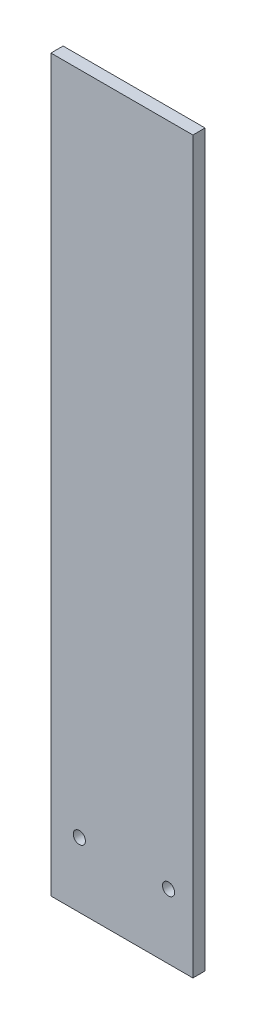
ISO-10303-21;
HEADER;
FILE_DESCRIPTION(('STEP AP214'),'2;1');
FILE_NAME('part.step','',(''),(''),'','','');
FILE_SCHEMA(('AUTOMOTIVE_DESIGN { 1 0 10303 214 1 1 1 1 }'));
ENDSEC;
DATA;
#1=APPLICATION_CONTEXT('core data for automotive mechanical design processes');
#2=APPLICATION_PROTOCOL_DEFINITION('international standard','automotive_design',2000,#1);
#3=PRODUCT_CONTEXT('',#1,'mechanical');
#4=PRODUCT('Part','Part','',(#3));
#5=PRODUCT_RELATED_PRODUCT_CATEGORY('part','',(#4));
#6=PRODUCT_DEFINITION_FORMATION('','',#4);
#7=PRODUCT_DEFINITION_CONTEXT('part definition',#1,'design');
#8=PRODUCT_DEFINITION('design','',#6,#7);
#9=PRODUCT_DEFINITION_SHAPE('','',#8);
#10=(LENGTH_UNIT() NAMED_UNIT(*) SI_UNIT(.MILLI.,.METRE.));
#11=(NAMED_UNIT(*) PLANE_ANGLE_UNIT() SI_UNIT($,.RADIAN.));
#12=(NAMED_UNIT(*) SI_UNIT($,.STERADIAN.) SOLID_ANGLE_UNIT());
#13=UNCERTAINTY_MEASURE_WITH_UNIT(LENGTH_MEASURE(1.E-05),#10,'distance_accuracy_value','');
#14=(GEOMETRIC_REPRESENTATION_CONTEXT(3) GLOBAL_UNCERTAINTY_ASSIGNED_CONTEXT((#13)) GLOBAL_UNIT_ASSIGNED_CONTEXT((#10,
#11,#12)) REPRESENTATION_CONTEXT('',''));
#15=CARTESIAN_POINT('',(0.,0.,0.));
#16=DIRECTION('',(0.,0.,1.));
#17=DIRECTION('',(1.,0.,0.));
#18=AXIS2_PLACEMENT_3D('',#15,#16,#17);
#19=CARTESIAN_POINT('',(0.,0.,3.));
#20=DIRECTION('',(0.,0.,1.));
#21=DIRECTION('',(1.,0.,0.));
#22=AXIS2_PLACEMENT_3D('',#19,#20,#21);
#23=PLANE('',#22);
#24=CARTESIAN_POINT('',(11.5000000000037,-74.,3.));
#25=DIRECTION('',(0.,0.,1.));
#26=DIRECTION('',(1.,0.,0.));
#27=AXIS2_PLACEMENT_3D('',#24,#25,#26);
#28=CIRCLE('',#27,1.50000000000001);
#29=CARTESIAN_POINT('',(13.0000000000037,-74.,3.));
#30=VERTEX_POINT('',#29);
#31=EDGE_CURVE('E112',#30,#30,#28,.T.);
#32=ORIENTED_EDGE('',*,*,#31,.F.);
#33=EDGE_LOOP('',(#32));
#34=FACE_BOUND('',#33,.T.);
#35=DIRECTION('',(0.,1.,0.));
#36=VECTOR('',#35,1.);
#37=CARTESIAN_POINT('',(17.5,90.,3.));
#38=LINE('',#37,#36);
#39=CARTESIAN_POINT('',(17.5,-90.,3.));
#40=VERTEX_POINT('',#39);
#41=CARTESIAN_POINT('',(17.5,90.,3.));
#42=VERTEX_POINT('',#41);
#43=EDGE_CURVE('E97',#40,#42,#38,.T.);
#44=ORIENTED_EDGE('',*,*,#43,.T.);
#45=DIRECTION('',(-1.,0.,0.));
#46=VECTOR('',#45,1.);
#47=CARTESIAN_POINT('',(-17.5,90.,3.));
#48=LINE('',#47,#46);
#49=CARTESIAN_POINT('',(-17.5,90.,3.));
#50=VERTEX_POINT('',#49);
#51=EDGE_CURVE('E92',#42,#50,#48,.T.);
#52=ORIENTED_EDGE('',*,*,#51,.T.);
#53=DIRECTION('',(0.,-1.,0.));
#54=VECTOR('',#53,1.);
#55=CARTESIAN_POINT('',(-17.5,90.,3.));
#56=LINE('',#55,#54);
#57=CARTESIAN_POINT('',(-17.5,-90.,3.));
#58=VERTEX_POINT('',#57);
#59=EDGE_CURVE('E95',#50,#58,#56,.T.);
#60=ORIENTED_EDGE('',*,*,#59,.T.);
#61=DIRECTION('',(1.,0.,0.));
#62=VECTOR('',#61,1.);
#63=CARTESIAN_POINT('',(-17.5,-90.,3.));
#64=LINE('',#63,#62);
#65=EDGE_CURVE('E62',#58,#40,#64,.T.);
#66=ORIENTED_EDGE('',*,*,#65,.T.);
#67=EDGE_LOOP('',(#44,#52,#60,#66));
#68=FACE_BOUND('',#67,.T.);
#69=CARTESIAN_POINT('',(-10.4999999999963,-74.,3.));
#70=DIRECTION('',(0.,0.,1.));
#71=DIRECTION('',(1.,0.,0.));
#72=AXIS2_PLACEMENT_3D('',#69,#70,#71);
#73=CIRCLE('',#72,1.50000000000001);
#74=CARTESIAN_POINT('',(-8.99999999999629,-74.,3.));
#75=VERTEX_POINT('',#74);
#76=EDGE_CURVE('E127',#75,#75,#73,.T.);
#77=ORIENTED_EDGE('',*,*,#76,.F.);
#78=EDGE_LOOP('',(#77));
#79=FACE_BOUND('',#78,.T.);
#80=ADVANCED_FACE('F45',(#34,#68,#79),#23,.T.);
#81=CARTESIAN_POINT('',(0.,0.,0.));
#82=DIRECTION('',(0.,0.,1.));
#83=DIRECTION('',(1.,0.,0.));
#84=AXIS2_PLACEMENT_3D('',#81,#82,#83);
#85=PLANE('',#84);
#86=DIRECTION('',(0.,1.,0.));
#87=VECTOR('',#86,1.);
#88=CARTESIAN_POINT('',(17.5,90.,0.));
#89=LINE('',#88,#87);
#90=CARTESIAN_POINT('',(17.5,-90.,0.));
#91=VERTEX_POINT('',#90);
#92=CARTESIAN_POINT('',(17.5,90.,0.));
#93=VERTEX_POINT('',#92);
#94=EDGE_CURVE('E109',#91,#93,#89,.T.);
#95=ORIENTED_EDGE('',*,*,#94,.F.);
#96=DIRECTION('',(1.,0.,0.));
#97=VECTOR('',#96,1.);
#98=CARTESIAN_POINT('',(-17.5,-90.,0.));
#99=LINE('',#98,#97);
#100=CARTESIAN_POINT('',(-17.5,-90.,0.));
#101=VERTEX_POINT('',#100);
#102=EDGE_CURVE('E85',#101,#91,#99,.T.);
#103=ORIENTED_EDGE('',*,*,#102,.F.);
#104=DIRECTION('',(0.,-1.,0.));
#105=VECTOR('',#104,1.);
#106=CARTESIAN_POINT('',(-17.5,90.,0.));
#107=LINE('',#106,#105);
#108=CARTESIAN_POINT('',(-17.5,90.,0.));
#109=VERTEX_POINT('',#108);
#110=EDGE_CURVE('E79',#109,#101,#107,.T.);
#111=ORIENTED_EDGE('',*,*,#110,.F.);
#112=DIRECTION('',(-1.,0.,0.));
#113=VECTOR('',#112,1.);
#114=CARTESIAN_POINT('',(-17.5,90.,0.));
#115=LINE('',#114,#113);
#116=EDGE_CURVE('E101',#93,#109,#115,.T.);
#117=ORIENTED_EDGE('',*,*,#116,.F.);
#118=EDGE_LOOP('',(#95,#103,#111,#117));
#119=FACE_BOUND('',#118,.T.);
#120=CARTESIAN_POINT('',(11.5000000000037,-74.,0.));
#121=DIRECTION('',(0.,0.,1.));
#122=DIRECTION('',(1.,0.,0.));
#123=AXIS2_PLACEMENT_3D('',#120,#121,#122);
#124=CIRCLE('',#123,1.50000000000001);
#125=CARTESIAN_POINT('',(13.0000000000037,-74.,0.));
#126=VERTEX_POINT('',#125);
#127=EDGE_CURVE('E124',#126,#126,#124,.T.);
#128=ORIENTED_EDGE('',*,*,#127,.T.);
#129=EDGE_LOOP('',(#128));
#130=FACE_BOUND('',#129,.T.);
#131=CARTESIAN_POINT('',(-10.4999999999963,-74.,0.));
#132=DIRECTION('',(0.,0.,1.));
#133=DIRECTION('',(1.,0.,0.));
#134=AXIS2_PLACEMENT_3D('',#131,#132,#133);
#135=CIRCLE('',#134,1.50000000000001);
#136=CARTESIAN_POINT('',(-8.99999999999629,-74.,0.));
#137=VERTEX_POINT('',#136);
#138=EDGE_CURVE('E130',#137,#137,#135,.T.);
#139=ORIENTED_EDGE('',*,*,#138,.T.);
#140=EDGE_LOOP('',(#139));
#141=FACE_BOUND('',#140,.T.);
#142=ADVANCED_FACE('F120',(#119,#130,#141),#85,.F.);
#143=CARTESIAN_POINT('',(17.5,90.,3.));
#144=DIRECTION('',(-1.,0.,0.));
#145=DIRECTION('',(0.,-1.,0.));
#146=AXIS2_PLACEMENT_3D('',#143,#144,#145);
#147=PLANE('',#146);
#148=ORIENTED_EDGE('',*,*,#94,.T.);
#149=DIRECTION('',(0.,0.,-1.));
#150=VECTOR('',#149,1.);
#151=CARTESIAN_POINT('',(17.5,90.,3.));
#152=LINE('',#151,#150);
#153=EDGE_CURVE('E11',#42,#93,#152,.T.);
#154=ORIENTED_EDGE('',*,*,#153,.F.);
#155=ORIENTED_EDGE('',*,*,#43,.F.);
#156=DIRECTION('',(0.,0.,-1.));
#157=VECTOR('',#156,1.);
#158=CARTESIAN_POINT('',(17.5,-90.,3.));
#159=LINE('',#158,#157);
#160=EDGE_CURVE('E105',#40,#91,#159,.T.);
#161=ORIENTED_EDGE('',*,*,#160,.T.);
#162=EDGE_LOOP('',(#148,#154,#155,#161));
#163=FACE_BOUND('',#162,.T.);
#164=ADVANCED_FACE('F47',(#163),#147,.F.);
#165=CARTESIAN_POINT('',(-17.5,90.,3.));
#166=DIRECTION('',(0.,-1.,0.));
#167=DIRECTION('',(0.,0.,-1.));
#168=AXIS2_PLACEMENT_3D('',#165,#166,#167);
#169=PLANE('',#168);
#170=ORIENTED_EDGE('',*,*,#116,.T.);
#171=DIRECTION('',(0.,0.,-1.));
#172=VECTOR('',#171,1.);
#173=CARTESIAN_POINT('',(-17.5,90.,3.));
#174=LINE('',#173,#172);
#175=EDGE_CURVE('E54',#50,#109,#174,.T.);
#176=ORIENTED_EDGE('',*,*,#175,.F.);
#177=ORIENTED_EDGE('',*,*,#51,.F.);
#178=ORIENTED_EDGE('',*,*,#153,.T.);
#179=EDGE_LOOP('',(#170,#176,#177,#178));
#180=FACE_BOUND('',#179,.T.);
#181=ADVANCED_FACE('F100',(#180),#169,.F.);
#182=CARTESIAN_POINT('',(-17.5,90.,3.));
#183=DIRECTION('',(1.,0.,0.));
#184=DIRECTION('',(0.,1.,0.));
#185=AXIS2_PLACEMENT_3D('',#182,#183,#184);
#186=PLANE('',#185);
#187=ORIENTED_EDGE('',*,*,#110,.T.);
#188=DIRECTION('',(0.,0.,-1.));
#189=VECTOR('',#188,1.);
#190=CARTESIAN_POINT('',(-17.5,-90.,3.));
#191=LINE('',#190,#189);
#192=EDGE_CURVE('E102',#58,#101,#191,.T.);
#193=ORIENTED_EDGE('',*,*,#192,.F.);
#194=ORIENTED_EDGE('',*,*,#59,.F.);
#195=ORIENTED_EDGE('',*,*,#175,.T.);
#196=EDGE_LOOP('',(#187,#193,#194,#195));
#197=FACE_BOUND('',#196,.T.);
#198=ADVANCED_FACE('F103',(#197),#186,.F.);
#199=CARTESIAN_POINT('',(-17.5,-90.,3.));
#200=DIRECTION('',(0.,1.,0.));
#201=DIRECTION('',(0.,0.,1.));
#202=AXIS2_PLACEMENT_3D('',#199,#200,#201);
#203=PLANE('',#202);
#204=ORIENTED_EDGE('',*,*,#102,.T.);
#205=ORIENTED_EDGE('',*,*,#160,.F.);
#206=ORIENTED_EDGE('',*,*,#65,.F.);
#207=ORIENTED_EDGE('',*,*,#192,.T.);
#208=EDGE_LOOP('',(#204,#205,#206,#207));
#209=FACE_BOUND('',#208,.T.);
#210=ADVANCED_FACE('F117',(#209),#203,.F.);
#211=CARTESIAN_POINT('',(11.5000000000037,-74.,3.));
#212=DIRECTION('',(0.,0.,-1.));
#213=DIRECTION('',(-1.,0.,0.));
#214=AXIS2_PLACEMENT_3D('',#211,#212,#213);
#215=CYLINDRICAL_SURFACE('',#214,1.50000000000001);
#216=ORIENTED_EDGE('',*,*,#31,.T.);
#217=EDGE_LOOP('',(#216));
#218=FACE_BOUND('',#217,.T.);
#219=ORIENTED_EDGE('',*,*,#127,.F.);
#220=EDGE_LOOP('',(#219));
#221=FACE_BOUND('',#220,.T.);
#222=ADVANCED_FACE('F147',(#218,#221),#215,.F.);
#223=CARTESIAN_POINT('',(-10.4999999999963,-74.,3.));
#224=DIRECTION('',(0.,0.,-1.));
#225=DIRECTION('',(-1.,0.,0.));
#226=AXIS2_PLACEMENT_3D('',#223,#224,#225);
#227=CYLINDRICAL_SURFACE('',#226,1.50000000000001);
#228=ORIENTED_EDGE('',*,*,#76,.T.);
#229=EDGE_LOOP('',(#228));
#230=FACE_BOUND('',#229,.T.);
#231=ORIENTED_EDGE('',*,*,#138,.F.);
#232=EDGE_LOOP('',(#231));
#233=FACE_BOUND('',#232,.T.);
#234=ADVANCED_FACE('F136',(#230,#233),#227,.F.);
#235=CLOSED_SHELL('',(#80,#142,#164,#181,#198,#210,#222,#234));
#236=MANIFOLD_SOLID_BREP('B2',#235);
#237=ADVANCED_BREP_SHAPE_REPRESENTATION('',(#18,#236),#14);
#238=SHAPE_DEFINITION_REPRESENTATION(#9,#237);
ENDSEC;
END-ISO-10303-21;
